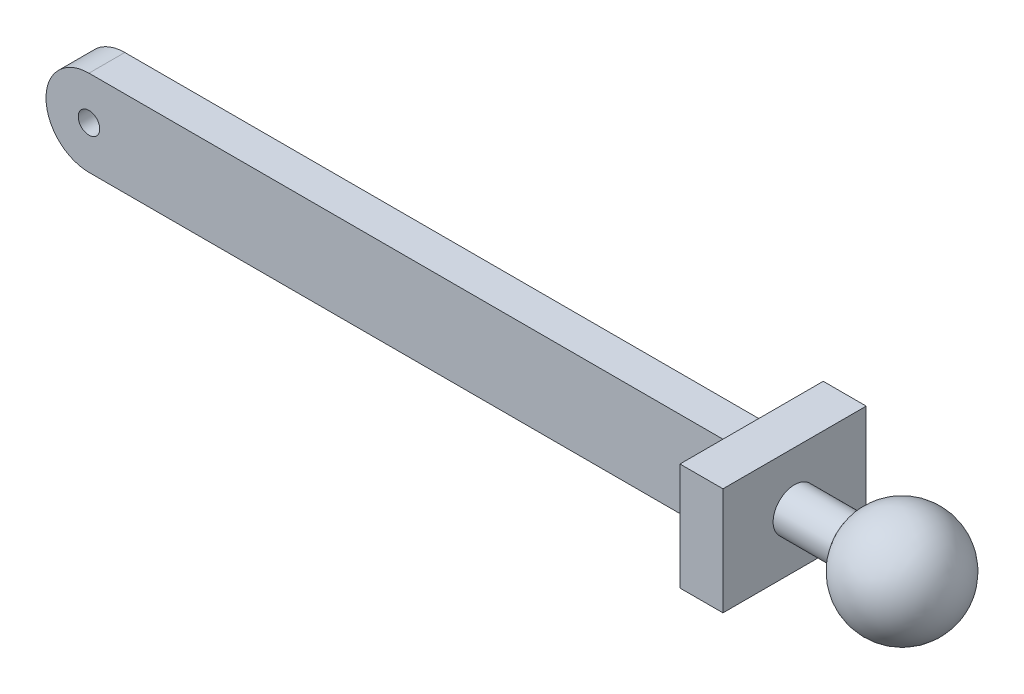
ISO-10303-21;
HEADER;
FILE_DESCRIPTION(('STEP AP214'),'2;1');
FILE_NAME('part.step','',(''),(''),'','','');
FILE_SCHEMA(('AUTOMOTIVE_DESIGN { 1 0 10303 214 1 1 1 1 }'));
ENDSEC;
DATA;
#1=APPLICATION_CONTEXT('core data for automotive mechanical design processes');
#2=APPLICATION_PROTOCOL_DEFINITION('international standard','automotive_design',2000,#1);
#3=PRODUCT_CONTEXT('',#1,'mechanical');
#4=PRODUCT('Part','Part','',(#3));
#5=PRODUCT_RELATED_PRODUCT_CATEGORY('part','',(#4));
#6=PRODUCT_DEFINITION_FORMATION('','',#4);
#7=PRODUCT_DEFINITION_CONTEXT('part definition',#1,'design');
#8=PRODUCT_DEFINITION('design','',#6,#7);
#9=PRODUCT_DEFINITION_SHAPE('','',#8);
#10=(LENGTH_UNIT() NAMED_UNIT(*) SI_UNIT(.MILLI.,.METRE.));
#11=(NAMED_UNIT(*) PLANE_ANGLE_UNIT() SI_UNIT($,.RADIAN.));
#12=(NAMED_UNIT(*) SI_UNIT($,.STERADIAN.) SOLID_ANGLE_UNIT());
#13=UNCERTAINTY_MEASURE_WITH_UNIT(LENGTH_MEASURE(1.E-05),#10,'distance_accuracy_value','');
#14=(GEOMETRIC_REPRESENTATION_CONTEXT(3) GLOBAL_UNCERTAINTY_ASSIGNED_CONTEXT((#13)) GLOBAL_UNIT_ASSIGNED_CONTEXT((#10,
#11,#12)) REPRESENTATION_CONTEXT('',''));
#15=CARTESIAN_POINT('',(0.,0.,0.));
#16=DIRECTION('',(0.,0.,1.));
#17=DIRECTION('',(1.,0.,0.));
#18=AXIS2_PLACEMENT_3D('',#15,#16,#17);
#19=CARTESIAN_POINT('',(111.,0.,2.5));
#20=DIRECTION('',(-1.,0.,0.));
#21=DIRECTION('',(0.,0.,1.));
#22=AXIS2_PLACEMENT_3D('',#19,#20,#21);
#23=CYLINDRICAL_SURFACE('',#22,3.);
#24=CARTESIAN_POINT('',(96.0000000000001,0.,2.5));
#25=DIRECTION('',(1.,0.,0.));
#26=DIRECTION('',(0.,0.,-1.));
#27=AXIS2_PLACEMENT_3D('',#24,#25,#26);
#28=CIRCLE('',#27,3.);
#29=CARTESIAN_POINT('',(96.0000000000001,0.,-0.5));
#30=VERTEX_POINT('',#29);
#31=EDGE_CURVE('E149',#30,#30,#28,.T.);
#32=ORIENTED_EDGE('',*,*,#31,.T.);
#33=EDGE_LOOP('',(#32));
#34=FACE_BOUND('',#33,.T.);
#35=CARTESIAN_POINT('',(104.126136457566,0.,2.5));
#36=DIRECTION('',(1.,0.,0.));
#37=DIRECTION('',(0.,0.,-1.));
#38=AXIS2_PLACEMENT_3D('',#35,#36,#37);
#39=CIRCLE('',#38,3.);
#40=CARTESIAN_POINT('',(104.126136457566,0.,-0.5));
#41=VERTEX_POINT('',#40);
#42=EDGE_CURVE('E11',#41,#41,#39,.T.);
#43=ORIENTED_EDGE('',*,*,#42,.F.);
#44=EDGE_LOOP('',(#43));
#45=FACE_BOUND('',#44,.T.);
#46=ADVANCED_FACE('F34',(#34,#45),#23,.T.);
#47=CARTESIAN_POINT('',(0.,-6.,5.));
#48=DIRECTION('',(0.,1.,0.));
#49=DIRECTION('',(-1.,0.,0.));
#50=AXIS2_PLACEMENT_3D('',#47,#48,#49);
#51=PLANE('',#50);
#52=DIRECTION('',(1.,0.,0.));
#53=VECTOR('',#52,1.);
#54=CARTESIAN_POINT('',(0.,-6.,0.));
#55=LINE('',#54,#53);
#56=CARTESIAN_POINT('',(0.,-6.,0.));
#57=VERTEX_POINT('',#56);
#58=CARTESIAN_POINT('',(90.,-6.,0.));
#59=VERTEX_POINT('',#58);
#60=EDGE_CURVE('E187',#57,#59,#55,.T.);
#61=ORIENTED_EDGE('',*,*,#60,.T.);
#62=DIRECTION('',(0.,0.,-1.));
#63=VECTOR('',#62,1.);
#64=CARTESIAN_POINT('',(90.,-6.,5.));
#65=LINE('',#64,#63);
#66=CARTESIAN_POINT('',(90.,-6.,5.));
#67=VERTEX_POINT('',#66);
#68=EDGE_CURVE('E203',#67,#59,#65,.T.);
#69=ORIENTED_EDGE('',*,*,#68,.F.);
#70=DIRECTION('',(1.,0.,0.));
#71=VECTOR('',#70,1.);
#72=CARTESIAN_POINT('',(0.,-6.,5.));
#73=LINE('',#72,#71);
#74=CARTESIAN_POINT('',(0.,-6.,5.));
#75=VERTEX_POINT('',#74);
#76=EDGE_CURVE('E173',#75,#67,#73,.T.);
#77=ORIENTED_EDGE('',*,*,#76,.F.);
#78=DIRECTION('',(0.,0.,-1.));
#79=VECTOR('',#78,1.);
#80=CARTESIAN_POINT('',(0.,-6.,5.));
#81=LINE('',#80,#79);
#82=EDGE_CURVE('E186',#75,#57,#81,.T.);
#83=ORIENTED_EDGE('',*,*,#82,.T.);
#84=EDGE_LOOP('',(#61,#69,#77,#83));
#85=FACE_BOUND('',#84,.T.);
#86=ADVANCED_FACE('F240',(#85),#51,.F.);
#87=CARTESIAN_POINT('',(0.,6.,5.));
#88=DIRECTION('',(0.,1.,0.));
#89=DIRECTION('',(-1.,0.,0.));
#90=AXIS2_PLACEMENT_3D('',#87,#88,#89);
#91=PLANE('',#90);
#92=DIRECTION('',(1.,0.,0.));
#93=VECTOR('',#92,1.);
#94=CARTESIAN_POINT('',(0.,6.,0.));
#95=LINE('',#94,#93);
#96=CARTESIAN_POINT('',(0.,6.,0.));
#97=VERTEX_POINT('',#96);
#98=CARTESIAN_POINT('',(90.,6.,0.));
#99=VERTEX_POINT('',#98);
#100=EDGE_CURVE('E190',#97,#99,#95,.T.);
#101=ORIENTED_EDGE('',*,*,#100,.F.);
#102=DIRECTION('',(0.,0.,-1.));
#103=VECTOR('',#102,1.);
#104=CARTESIAN_POINT('',(0.,6.,5.));
#105=LINE('',#104,#103);
#106=CARTESIAN_POINT('',(0.,6.,5.));
#107=VERTEX_POINT('',#106);
#108=EDGE_CURVE('E199',#107,#97,#105,.T.);
#109=ORIENTED_EDGE('',*,*,#108,.F.);
#110=DIRECTION('',(1.,0.,0.));
#111=VECTOR('',#110,1.);
#112=CARTESIAN_POINT('',(0.,6.,5.));
#113=LINE('',#112,#111);
#114=CARTESIAN_POINT('',(90.,6.,5.));
#115=VERTEX_POINT('',#114);
#116=EDGE_CURVE('E175',#107,#115,#113,.T.);
#117=ORIENTED_EDGE('',*,*,#116,.T.);
#118=DIRECTION('',(0.,0.,-1.));
#119=VECTOR('',#118,1.);
#120=CARTESIAN_POINT('',(90.,6.,5.));
#121=LINE('',#120,#119);
#122=EDGE_CURVE('E201',#115,#99,#121,.T.);
#123=ORIENTED_EDGE('',*,*,#122,.T.);
#124=EDGE_LOOP('',(#101,#109,#117,#123));
#125=FACE_BOUND('',#124,.T.);
#126=ADVANCED_FACE('F232',(#125),#91,.T.);
#127=CARTESIAN_POINT('',(0.,0.,5.));
#128=DIRECTION('',(0.,0.,-1.));
#129=DIRECTION('',(-1.,0.,0.));
#130=AXIS2_PLACEMENT_3D('',#127,#128,#129);
#131=CYLINDRICAL_SURFACE('',#130,1.5);
#132=CARTESIAN_POINT('',(0.,0.,5.));
#133=DIRECTION('',(0.,0.,1.));
#134=DIRECTION('',(1.,0.,0.));
#135=AXIS2_PLACEMENT_3D('',#132,#133,#134);
#136=CIRCLE('',#135,1.5);
#137=CARTESIAN_POINT('',(1.5,0.,5.));
#138=VERTEX_POINT('',#137);
#139=EDGE_CURVE('E181',#138,#138,#136,.T.);
#140=ORIENTED_EDGE('',*,*,#139,.T.);
#141=EDGE_LOOP('',(#140));
#142=FACE_BOUND('',#141,.T.);
#143=CARTESIAN_POINT('',(0.,0.,0.));
#144=DIRECTION('',(0.,0.,1.));
#145=DIRECTION('',(1.,0.,0.));
#146=AXIS2_PLACEMENT_3D('',#143,#144,#145);
#147=CIRCLE('',#146,1.5);
#148=CARTESIAN_POINT('',(1.5,0.,0.));
#149=VERTEX_POINT('',#148);
#150=EDGE_CURVE('E176',#149,#149,#147,.T.);
#151=ORIENTED_EDGE('',*,*,#150,.F.);
#152=EDGE_LOOP('',(#151));
#153=FACE_BOUND('',#152,.T.);
#154=ADVANCED_FACE('F246',(#142,#153),#131,.F.);
#155=CARTESIAN_POINT('',(0.,0.,5.));
#156=DIRECTION('',(0.,0.,-1.));
#157=DIRECTION('',(-1.,0.,0.));
#158=AXIS2_PLACEMENT_3D('',#155,#156,#157);
#159=CYLINDRICAL_SURFACE('',#158,6.);
#160=CARTESIAN_POINT('',(0.,0.,0.));
#161=DIRECTION('',(0.,0.,1.));
#162=DIRECTION('',(1.,0.,0.));
#163=AXIS2_PLACEMENT_3D('',#160,#161,#162);
#164=CIRCLE('',#163,6.);
#165=EDGE_CURVE('E193',#97,#57,#164,.T.);
#166=ORIENTED_EDGE('',*,*,#165,.T.);
#167=ORIENTED_EDGE('',*,*,#82,.F.);
#168=CARTESIAN_POINT('',(0.,0.,5.));
#169=DIRECTION('',(0.,0.,1.));
#170=DIRECTION('',(1.,0.,0.));
#171=AXIS2_PLACEMENT_3D('',#168,#169,#170);
#172=CIRCLE('',#171,6.);
#173=EDGE_CURVE('E179',#107,#75,#172,.T.);
#174=ORIENTED_EDGE('',*,*,#173,.F.);
#175=ORIENTED_EDGE('',*,*,#108,.T.);
#176=EDGE_LOOP('',(#166,#167,#174,#175));
#177=FACE_BOUND('',#176,.T.);
#178=ADVANCED_FACE('F238',(#177),#159,.T.);
#179=CARTESIAN_POINT('',(90.,0.,5.));
#180=DIRECTION('',(0.,0.,-1.));
#181=DIRECTION('',(-1.,0.,0.));
#182=AXIS2_PLACEMENT_3D('',#179,#180,#181);
#183=CYLINDRICAL_SURFACE('',#182,1.5);
#184=DIRECTION('',(0.,0.,-1.));
#185=VECTOR('',#184,1.);
#186=CARTESIAN_POINT('',(90.0000000000001,1.5,5.));
#187=LINE('',#186,#185);
#188=CARTESIAN_POINT('',(90.0000000000001,1.5,5.));
#189=VERTEX_POINT('',#188);
#190=CARTESIAN_POINT('',(90.,1.5,1.));
#191=VERTEX_POINT('',#190);
#192=EDGE_CURVE('E56',#189,#191,#187,.T.);
#193=ORIENTED_EDGE('',*,*,#192,.F.);
#194=CARTESIAN_POINT('',(90.,0.,5.));
#195=DIRECTION('',(0.,0.,1.));
#196=DIRECTION('',(1.,0.,0.));
#197=AXIS2_PLACEMENT_3D('',#194,#195,#196);
#198=CIRCLE('',#197,1.5);
#199=CARTESIAN_POINT('',(90.0000000000001,-1.5,5.));
#200=VERTEX_POINT('',#199);
#201=EDGE_CURVE('E184',#189,#200,#198,.T.);
#202=ORIENTED_EDGE('',*,*,#201,.T.);
#203=DIRECTION('',(0.,0.,-1.));
#204=VECTOR('',#203,1.);
#205=CARTESIAN_POINT('',(90.0000000000001,-1.5,5.));
#206=LINE('',#205,#204);
#207=CARTESIAN_POINT('',(90.,-1.5,1.));
#208=VERTEX_POINT('',#207);
#209=EDGE_CURVE('E170',#208,#200,#206,.F.);
#210=ORIENTED_EDGE('',*,*,#209,.F.);
#211=CARTESIAN_POINT('',(90.,0.,1.));
#212=DIRECTION('',(0.,0.,1.));
#213=DIRECTION('',(1.,0.,0.));
#214=AXIS2_PLACEMENT_3D('',#211,#212,#213);
#215=CIRCLE('',#214,1.5);
#216=EDGE_CURVE('E209',#208,#191,#215,.F.);
#217=ORIENTED_EDGE('',*,*,#216,.T.);
#218=EDGE_LOOP('',(#193,#202,#210,#217));
#219=FACE_BOUND('',#218,.T.);
#220=ADVANCED_FACE('F227',(#219),#183,.F.);
#221=CARTESIAN_POINT('',(0.,0.,5.));
#222=DIRECTION('',(0.,0.,1.));
#223=DIRECTION('',(1.,0.,0.));
#224=AXIS2_PLACEMENT_3D('',#221,#222,#223);
#225=PLANE('',#224);
#226=DIRECTION('',(0.,-1.,0.));
#227=VECTOR('',#226,1.);
#228=CARTESIAN_POINT('',(90.0000000000001,0.,5.));
#229=LINE('',#228,#227);
#230=EDGE_CURVE('E167',#115,#189,#229,.T.);
#231=ORIENTED_EDGE('',*,*,#230,.F.);
#232=ORIENTED_EDGE('',*,*,#116,.F.);
#233=ORIENTED_EDGE('',*,*,#173,.T.);
#234=ORIENTED_EDGE('',*,*,#76,.T.);
#235=EDGE_CURVE('E49',#200,#67,#229,.T.);
#236=ORIENTED_EDGE('',*,*,#235,.F.);
#237=ORIENTED_EDGE('',*,*,#201,.F.);
#238=EDGE_LOOP('',(#231,#232,#233,#234,#236,#237));
#239=FACE_BOUND('',#238,.T.);
#240=ORIENTED_EDGE('',*,*,#139,.F.);
#241=EDGE_LOOP('',(#240));
#242=FACE_BOUND('',#241,.T.);
#243=ADVANCED_FACE('F228',(#239,#242),#225,.T.);
#244=CARTESIAN_POINT('',(0.,0.,0.));
#245=DIRECTION('',(0.,0.,1.));
#246=DIRECTION('',(1.,0.,0.));
#247=AXIS2_PLACEMENT_3D('',#244,#245,#246);
#248=PLANE('',#247);
#249=ORIENTED_EDGE('',*,*,#100,.T.);
#250=DIRECTION('',(0.,-1.,0.));
#251=VECTOR('',#250,1.);
#252=CARTESIAN_POINT('',(90.0000000000001,0.,0.));
#253=LINE('',#252,#251);
#254=CARTESIAN_POINT('',(90.,2.5,0.));
#255=VERTEX_POINT('',#254);
#256=EDGE_CURVE('E159',#99,#255,#253,.T.);
#257=ORIENTED_EDGE('',*,*,#256,.T.);
#258=CARTESIAN_POINT('',(90.,0.,0.));
#259=DIRECTION('',(0.,0.,1.));
#260=DIRECTION('',(1.,0.,0.));
#261=AXIS2_PLACEMENT_3D('',#258,#259,#260);
#262=CIRCLE('',#261,2.5);
#263=CARTESIAN_POINT('',(90.,-2.5,0.));
#264=VERTEX_POINT('',#263);
#265=EDGE_CURVE('E206',#255,#264,#262,.T.);
#266=ORIENTED_EDGE('',*,*,#265,.T.);
#267=EDGE_CURVE('E165',#264,#59,#253,.T.);
#268=ORIENTED_EDGE('',*,*,#267,.T.);
#269=ORIENTED_EDGE('',*,*,#60,.F.);
#270=ORIENTED_EDGE('',*,*,#165,.F.);
#271=EDGE_LOOP('',(#249,#257,#266,#268,#269,#270));
#272=FACE_BOUND('',#271,.T.);
#273=ORIENTED_EDGE('',*,*,#150,.T.);
#274=EDGE_LOOP('',(#273));
#275=FACE_BOUND('',#274,.T.);
#276=ADVANCED_FACE('F220',(#272,#275),#248,.F.);
#277=CARTESIAN_POINT('',(90.,0.,1.));
#278=DIRECTION('',(0.,0.,1.));
#279=DIRECTION('',(1.,0.,0.));
#280=AXIS2_PLACEMENT_3D('',#277,#278,#279);
#281=TOROIDAL_SURFACE('',#280,2.5,1.);
#282=CARTESIAN_POINT('',(90.,-2.5,1.));
#283=DIRECTION('',(-1.,0.,0.));
#284=DIRECTION('',(0.,0.,1.));
#285=AXIS2_PLACEMENT_3D('',#282,#283,#284);
#286=CIRCLE('',#285,1.);
#287=EDGE_CURVE('E42',#264,#208,#286,.F.);
#288=ORIENTED_EDGE('',*,*,#287,.F.);
#289=ORIENTED_EDGE('',*,*,#265,.F.);
#290=CARTESIAN_POINT('',(90.,2.5,1.));
#291=DIRECTION('',(-1.,0.,0.));
#292=DIRECTION('',(0.,0.,1.));
#293=AXIS2_PLACEMENT_3D('',#290,#291,#292);
#294=CIRCLE('',#293,1.);
#295=EDGE_CURVE('E211',#191,#255,#294,.F.);
#296=ORIENTED_EDGE('',*,*,#295,.F.);
#297=ORIENTED_EDGE('',*,*,#216,.F.);
#298=EDGE_LOOP('',(#288,#289,#296,#297));
#299=FACE_BOUND('',#298,.T.);
#300=ADVANCED_FACE('F36',(#299),#281,.T.);
#301=CARTESIAN_POINT('',(90.0000000000001,-7.5,-7.5));
#302=DIRECTION('',(-1.,0.,0.));
#303=DIRECTION('',(0.,0.,1.));
#304=AXIS2_PLACEMENT_3D('',#301,#302,#303);
#305=PLANE('',#304);
#306=ORIENTED_EDGE('',*,*,#209,.T.);
#307=ORIENTED_EDGE('',*,*,#235,.T.);
#308=ORIENTED_EDGE('',*,*,#68,.T.);
#309=ORIENTED_EDGE('',*,*,#267,.F.);
#310=ORIENTED_EDGE('',*,*,#287,.T.);
#311=EDGE_LOOP('',(#306,#307,#308,#309,#310));
#312=FACE_BOUND('',#311,.T.);
#313=ORIENTED_EDGE('',*,*,#122,.F.);
#314=ORIENTED_EDGE('',*,*,#230,.T.);
#315=ORIENTED_EDGE('',*,*,#192,.T.);
#316=ORIENTED_EDGE('',*,*,#295,.T.);
#317=ORIENTED_EDGE('',*,*,#256,.F.);
#318=EDGE_LOOP('',(#313,#314,#315,#316,#317));
#319=FACE_BOUND('',#318,.T.);
#320=DIRECTION('',(0.,-1.,0.));
#321=VECTOR('',#320,1.);
#322=CARTESIAN_POINT('',(90.0000000000001,-7.5,12.5));
#323=LINE('',#322,#321);
#324=CARTESIAN_POINT('',(90.0000000000001,7.5,12.5));
#325=VERTEX_POINT('',#324);
#326=CARTESIAN_POINT('',(90.0000000000001,-7.5,12.5));
#327=VERTEX_POINT('',#326);
#328=EDGE_CURVE('E153',#325,#327,#323,.T.);
#329=ORIENTED_EDGE('',*,*,#328,.F.);
#330=DIRECTION('',(0.,0.,1.));
#331=VECTOR('',#330,1.);
#332=CARTESIAN_POINT('',(90.0000000000001,7.5,-7.5));
#333=LINE('',#332,#331);
#334=CARTESIAN_POINT('',(90.0000000000001,7.5,-7.5));
#335=VERTEX_POINT('',#334);
#336=EDGE_CURVE('E142',#335,#325,#333,.T.);
#337=ORIENTED_EDGE('',*,*,#336,.F.);
#338=DIRECTION('',(0.,-1.,0.));
#339=VECTOR('',#338,1.);
#340=CARTESIAN_POINT('',(90.0000000000001,-7.5,-7.5));
#341=LINE('',#340,#339);
#342=CARTESIAN_POINT('',(90.0000000000001,-7.5,-7.5));
#343=VERTEX_POINT('',#342);
#344=EDGE_CURVE('E136',#335,#343,#341,.T.);
#345=ORIENTED_EDGE('',*,*,#344,.T.);
#346=DIRECTION('',(0.,0.,1.));
#347=VECTOR('',#346,1.);
#348=CARTESIAN_POINT('',(90.0000000000001,-7.5,-7.5));
#349=LINE('',#348,#347);
#350=EDGE_CURVE('E118',#343,#327,#349,.T.);
#351=ORIENTED_EDGE('',*,*,#350,.T.);
#352=EDGE_LOOP('',(#329,#337,#345,#351));
#353=FACE_BOUND('',#352,.T.);
#354=ADVANCED_FACE('F141',(#312,#319,#353),#305,.T.);
#355=CARTESIAN_POINT('',(90.0000000000001,7.5,-7.5));
#356=DIRECTION('',(0.,1.,0.));
#357=DIRECTION('',(-1.,0.,0.));
#358=AXIS2_PLACEMENT_3D('',#355,#356,#357);
#359=PLANE('',#358);
#360=DIRECTION('',(-1.,0.,0.));
#361=VECTOR('',#360,1.);
#362=CARTESIAN_POINT('',(90.0000000000001,7.5,12.5));
#363=LINE('',#362,#361);
#364=CARTESIAN_POINT('',(96.0000000000001,7.5,12.5));
#365=VERTEX_POINT('',#364);
#366=EDGE_CURVE('E143',#365,#325,#363,.T.);
#367=ORIENTED_EDGE('',*,*,#366,.F.);
#368=DIRECTION('',(0.,0.,1.));
#369=VECTOR('',#368,1.);
#370=CARTESIAN_POINT('',(96.0000000000001,7.5,-7.5));
#371=LINE('',#370,#369);
#372=CARTESIAN_POINT('',(96.0000000000001,7.5,-7.5));
#373=VERTEX_POINT('',#372);
#374=EDGE_CURVE('E160',#373,#365,#371,.T.);
#375=ORIENTED_EDGE('',*,*,#374,.F.);
#376=DIRECTION('',(-1.,0.,0.));
#377=VECTOR('',#376,1.);
#378=CARTESIAN_POINT('',(90.0000000000001,7.5,-7.5));
#379=LINE('',#378,#377);
#380=EDGE_CURVE('E129',#373,#335,#379,.T.);
#381=ORIENTED_EDGE('',*,*,#380,.T.);
#382=ORIENTED_EDGE('',*,*,#336,.T.);
#383=EDGE_LOOP('',(#367,#375,#381,#382));
#384=FACE_BOUND('',#383,.T.);
#385=ADVANCED_FACE('F264',(#384),#359,.T.);
#386=CARTESIAN_POINT('',(96.0000000000001,-7.5,-7.5));
#387=DIRECTION('',(1.,0.,0.));
#388=DIRECTION('',(0.,0.,-1.));
#389=AXIS2_PLACEMENT_3D('',#386,#387,#388);
#390=PLANE('',#389);
#391=ORIENTED_EDGE('',*,*,#31,.F.);
#392=EDGE_LOOP('',(#391));
#393=FACE_BOUND('',#392,.T.);
#394=DIRECTION('',(0.,1.,0.));
#395=VECTOR('',#394,1.);
#396=CARTESIAN_POINT('',(96.0000000000001,-7.5,12.5));
#397=LINE('',#396,#395);
#398=CARTESIAN_POINT('',(96.0000000000001,-7.5,12.5));
#399=VERTEX_POINT('',#398);
#400=EDGE_CURVE('E146',#399,#365,#397,.T.);
#401=ORIENTED_EDGE('',*,*,#400,.F.);
#402=DIRECTION('',(0.,0.,1.));
#403=VECTOR('',#402,1.);
#404=CARTESIAN_POINT('',(96.0000000000001,-7.5,-7.5));
#405=LINE('',#404,#403);
#406=CARTESIAN_POINT('',(96.0000000000001,-7.5,-7.5));
#407=VERTEX_POINT('',#406);
#408=EDGE_CURVE('E128',#407,#399,#405,.T.);
#409=ORIENTED_EDGE('',*,*,#408,.F.);
#410=DIRECTION('',(0.,1.,0.));
#411=VECTOR('',#410,1.);
#412=CARTESIAN_POINT('',(96.0000000000001,-7.5,-7.5));
#413=LINE('',#412,#411);
#414=EDGE_CURVE('E139',#407,#373,#413,.T.);
#415=ORIENTED_EDGE('',*,*,#414,.T.);
#416=ORIENTED_EDGE('',*,*,#374,.T.);
#417=EDGE_LOOP('',(#401,#409,#415,#416));
#418=FACE_BOUND('',#417,.T.);
#419=ADVANCED_FACE('F267',(#393,#418),#390,.T.);
#420=CARTESIAN_POINT('',(90.0000000000001,-7.5,-7.5));
#421=DIRECTION('',(0.,-1.,0.));
#422=DIRECTION('',(0.,0.,-1.));
#423=AXIS2_PLACEMENT_3D('',#420,#421,#422);
#424=PLANE('',#423);
#425=DIRECTION('',(1.,0.,0.));
#426=VECTOR('',#425,1.);
#427=CARTESIAN_POINT('',(90.0000000000001,-7.5,12.5));
#428=LINE('',#427,#426);
#429=EDGE_CURVE('E123',#327,#399,#428,.T.);
#430=ORIENTED_EDGE('',*,*,#429,.F.);
#431=ORIENTED_EDGE('',*,*,#350,.F.);
#432=DIRECTION('',(1.,0.,0.));
#433=VECTOR('',#432,1.);
#434=CARTESIAN_POINT('',(90.0000000000001,-7.5,-7.5));
#435=LINE('',#434,#433);
#436=EDGE_CURVE('E121',#343,#407,#435,.T.);
#437=ORIENTED_EDGE('',*,*,#436,.T.);
#438=ORIENTED_EDGE('',*,*,#408,.T.);
#439=EDGE_LOOP('',(#430,#431,#437,#438));
#440=FACE_BOUND('',#439,.T.);
#441=ADVANCED_FACE('F120',(#440),#424,.T.);
#442=CARTESIAN_POINT('',(0.,0.,-7.5));
#443=DIRECTION('',(0.,0.,-1.));
#444=DIRECTION('',(-1.,0.,0.));
#445=AXIS2_PLACEMENT_3D('',#442,#443,#444);
#446=PLANE('',#445);
#447=ORIENTED_EDGE('',*,*,#344,.F.);
#448=ORIENTED_EDGE('',*,*,#380,.F.);
#449=ORIENTED_EDGE('',*,*,#414,.F.);
#450=ORIENTED_EDGE('',*,*,#436,.F.);
#451=EDGE_LOOP('',(#447,#448,#449,#450));
#452=FACE_BOUND('',#451,.T.);
#453=ADVANCED_FACE('F134',(#452),#446,.T.);
#454=CARTESIAN_POINT('',(0.,0.,12.5));
#455=DIRECTION('',(0.,0.,-1.));
#456=DIRECTION('',(-1.,0.,0.));
#457=AXIS2_PLACEMENT_3D('',#454,#455,#456);
#458=PLANE('',#457);
#459=ORIENTED_EDGE('',*,*,#328,.T.);
#460=ORIENTED_EDGE('',*,*,#429,.T.);
#461=ORIENTED_EDGE('',*,*,#400,.T.);
#462=ORIENTED_EDGE('',*,*,#366,.T.);
#463=EDGE_LOOP('',(#459,#460,#461,#462));
#464=FACE_BOUND('',#463,.T.);
#465=ADVANCED_FACE('F274',(#464),#458,.F.);
#466=CARTESIAN_POINT('',(111.,0.,2.5));
#467=DIRECTION('',(0.,1.,0.));
#468=DIRECTION('',(0.,0.,-1.));
#469=AXIS2_PLACEMENT_3D('',#466,#467,#468);
#470=SPHERICAL_SURFACE('',#469,7.5);
#471=CARTESIAN_POINT('',(111.,0.,2.5));
#472=DIRECTION('',(1.,0.,0.));
#473=DIRECTION('',(0.,0.,-1.));
#474=AXIS2_PLACEMENT_3D('',#471,#472,#473);
#475=SPHERICAL_SURFACE('',#474,7.5);
#476=ORIENTED_EDGE('',*,*,#42,.T.);
#477=EDGE_LOOP('',(#476));
#478=FACE_BOUND('',#477,.T.);
#479=ADVANCED_FACE('F277',(#478),#475,.T.);
#480=CLOSED_SHELL('',(#46,#86,#126,#154,#178,#220,#243,#276,#300,#354,#385,#419,#441,#453,#465,#479));
#481=MANIFOLD_SOLID_BREP('B2',#480);
#482=ADVANCED_BREP_SHAPE_REPRESENTATION('',(#18,#481),#14);
#483=SHAPE_DEFINITION_REPRESENTATION(#9,#482);
ENDSEC;
END-ISO-10303-21;
